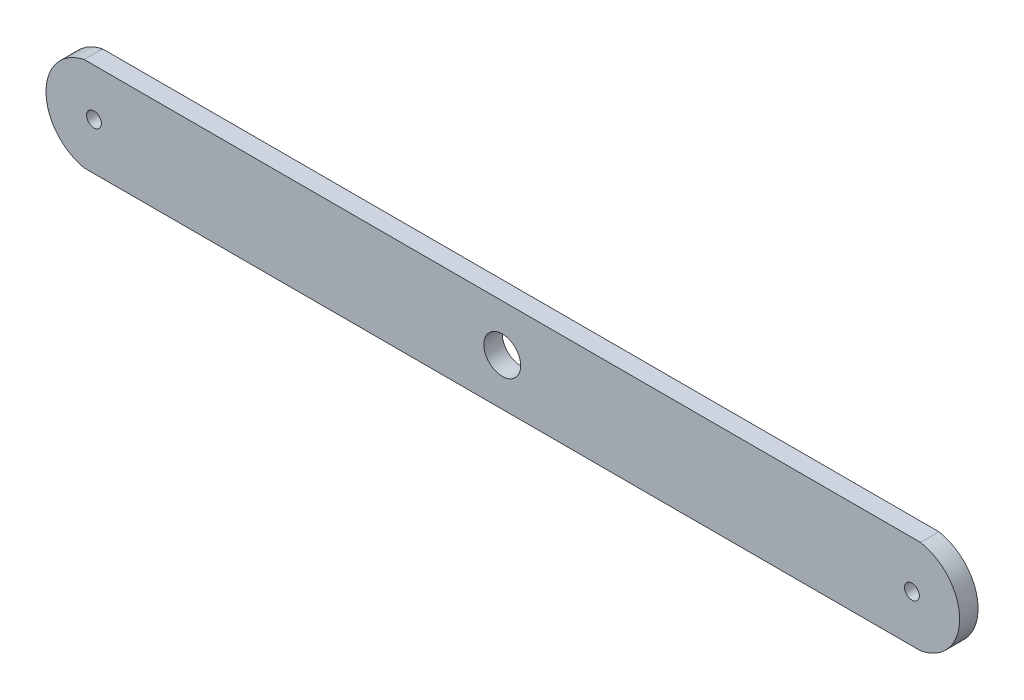
ISO-10303-21;
HEADER;
FILE_DESCRIPTION(('STEP AP214'),'2;1');
FILE_NAME('part.step','',(''),(''),'','','');
FILE_SCHEMA(('AUTOMOTIVE_DESIGN { 1 0 10303 214 1 1 1 1 }'));
ENDSEC;
DATA;
#1=APPLICATION_CONTEXT('core data for automotive mechanical design processes');
#2=APPLICATION_PROTOCOL_DEFINITION('international standard','automotive_design',2000,#1);
#3=PRODUCT_CONTEXT('',#1,'mechanical');
#4=PRODUCT('Part','Part','',(#3));
#5=PRODUCT_RELATED_PRODUCT_CATEGORY('part','',(#4));
#6=PRODUCT_DEFINITION_FORMATION('','',#4);
#7=PRODUCT_DEFINITION_CONTEXT('part definition',#1,'design');
#8=PRODUCT_DEFINITION('design','',#6,#7);
#9=PRODUCT_DEFINITION_SHAPE('','',#8);
#10=(LENGTH_UNIT() NAMED_UNIT(*) SI_UNIT(.MILLI.,.METRE.));
#11=(NAMED_UNIT(*) PLANE_ANGLE_UNIT() SI_UNIT($,.RADIAN.));
#12=(NAMED_UNIT(*) SI_UNIT($,.STERADIAN.) SOLID_ANGLE_UNIT());
#13=UNCERTAINTY_MEASURE_WITH_UNIT(LENGTH_MEASURE(1.E-05),#10,'distance_accuracy_value','');
#14=(GEOMETRIC_REPRESENTATION_CONTEXT(3) GLOBAL_UNCERTAINTY_ASSIGNED_CONTEXT((#13)) GLOBAL_UNIT_ASSIGNED_CONTEXT((#10,
#11,#12)) REPRESENTATION_CONTEXT('',''));
#15=CARTESIAN_POINT('',(0.,0.,0.));
#16=DIRECTION('',(0.,0.,1.));
#17=DIRECTION('',(1.,0.,0.));
#18=AXIS2_PLACEMENT_3D('',#15,#16,#17);
#19=CARTESIAN_POINT('',(-228.502311114203,0.523539483722092,10.));
#20=DIRECTION('',(0.,0.,1.));
#21=DIRECTION('',(1.,0.,0.));
#22=AXIS2_PLACEMENT_3D('',#19,#20,#21);
#23=PLANE('',#22);
#24=CARTESIAN_POINT('',(-6.88731111420254,0.523539483722092,10.));
#25=DIRECTION('',(0.,0.,1.));
#26=DIRECTION('',(1.,0.,0.));
#27=AXIS2_PLACEMENT_3D('',#24,#25,#26);
#28=CIRCLE('',#27,10.);
#29=CARTESIAN_POINT('',(3.11268888579746,0.523539483722092,10.));
#30=VERTEX_POINT('',#29);
#31=EDGE_CURVE('E136',#30,#30,#28,.T.);
#32=ORIENTED_EDGE('',*,*,#31,.F.);
#33=EDGE_LOOP('',(#32));
#34=FACE_BOUND('',#33,.T.);
#35=CARTESIAN_POINT('',(-228.502311114203,0.523539483722092,10.));
#36=DIRECTION('',(0.,0.,1.));
#37=DIRECTION('',(1.,0.,0.));
#38=AXIS2_PLACEMENT_3D('',#35,#36,#37);
#39=CIRCLE('',#38,26.048873997566);
#40=CARTESIAN_POINT('',(-233.912946186712,26.0042942734295,10.));
#41=VERTEX_POINT('',#40);
#42=CARTESIAN_POINT('',(-233.912946186712,-24.9572153059853,10.));
#43=VERTEX_POINT('',#42);
#44=EDGE_CURVE('E94',#41,#43,#39,.T.);
#45=ORIENTED_EDGE('',*,*,#44,.T.);
#46=DIRECTION('',(1.,0.,0.));
#47=VECTOR('',#46,1.);
#48=CARTESIAN_POINT('',(-233.912946186712,-24.9572153059853,10.));
#49=LINE('',#48,#47);
#50=CARTESIAN_POINT('',(220.138323958307,-24.9572153059853,10.));
#51=VERTEX_POINT('',#50);
#52=EDGE_CURVE('E89',#43,#51,#49,.T.);
#53=ORIENTED_EDGE('',*,*,#52,.T.);
#54=CARTESIAN_POINT('',(215.497688885797,0.523539483722092,10.));
#55=DIRECTION('',(0.,0.,1.));
#56=DIRECTION('',(1.,0.,0.));
#57=AXIS2_PLACEMENT_3D('',#54,#55,#56);
#58=CIRCLE('',#57,25.8998910910723);
#59=CARTESIAN_POINT('',(220.138323958307,26.0042942734295,10.));
#60=VERTEX_POINT('',#59);
#61=EDGE_CURVE('E92',#51,#60,#58,.T.);
#62=ORIENTED_EDGE('',*,*,#61,.T.);
#63=DIRECTION('',(-1.,0.,0.));
#64=VECTOR('',#63,1.);
#65=CARTESIAN_POINT('',(-233.912946186712,26.0042942734295,10.));
#66=LINE('',#65,#64);
#67=EDGE_CURVE('E59',#60,#41,#66,.T.);
#68=ORIENTED_EDGE('',*,*,#67,.T.);
#69=EDGE_LOOP('',(#45,#53,#62,#68));
#70=FACE_BOUND('',#69,.T.);
#71=CARTESIAN_POINT('',(-228.502311114203,0.523539483722092,10.));
#72=DIRECTION('',(0.,0.,1.));
#73=DIRECTION('',(1.,0.,0.));
#74=AXIS2_PLACEMENT_3D('',#71,#72,#73);
#75=CIRCLE('',#74,3.99999999999999);
#76=CARTESIAN_POINT('',(-224.502311114203,0.523539483722092,10.));
#77=VERTEX_POINT('',#76);
#78=EDGE_CURVE('E114',#77,#77,#75,.T.);
#79=ORIENTED_EDGE('',*,*,#78,.F.);
#80=EDGE_LOOP('',(#79));
#81=FACE_BOUND('',#80,.T.);
#82=CARTESIAN_POINT('',(215.497688885797,0.523539483722092,10.));
#83=DIRECTION('',(0.,0.,1.));
#84=DIRECTION('',(1.,0.,0.));
#85=AXIS2_PLACEMENT_3D('',#82,#83,#84);
#86=CIRCLE('',#85,3.99999999999999);
#87=CARTESIAN_POINT('',(219.497688885797,0.523539483722092,10.));
#88=VERTEX_POINT('',#87);
#89=EDGE_CURVE('E144',#88,#88,#86,.T.);
#90=ORIENTED_EDGE('',*,*,#89,.F.);
#91=EDGE_LOOP('',(#90));
#92=FACE_BOUND('',#91,.T.);
#93=ADVANCED_FACE('F41',(#34,#70,#81,#92),#23,.T.);
#94=CARTESIAN_POINT('',(-228.502311114203,0.523539483722092,0.));
#95=DIRECTION('',(0.,0.,1.));
#96=DIRECTION('',(1.,0.,0.));
#97=AXIS2_PLACEMENT_3D('',#94,#95,#96);
#98=PLANE('',#97);
#99=CARTESIAN_POINT('',(-228.502311114203,0.523539483722092,0.));
#100=DIRECTION('',(0.,0.,1.));
#101=DIRECTION('',(1.,0.,0.));
#102=AXIS2_PLACEMENT_3D('',#99,#100,#101);
#103=CIRCLE('',#102,26.048873997566);
#104=CARTESIAN_POINT('',(-233.912946186712,26.0042942734295,0.));
#105=VERTEX_POINT('',#104);
#106=CARTESIAN_POINT('',(-233.912946186712,-24.9572153059853,0.));
#107=VERTEX_POINT('',#106);
#108=EDGE_CURVE('E110',#105,#107,#103,.T.);
#109=ORIENTED_EDGE('',*,*,#108,.F.);
#110=DIRECTION('',(-1.,0.,0.));
#111=VECTOR('',#110,1.);
#112=CARTESIAN_POINT('',(-233.912946186712,26.0042942734295,0.));
#113=LINE('',#112,#111);
#114=CARTESIAN_POINT('',(220.138323958307,26.0042942734295,0.));
#115=VERTEX_POINT('',#114);
#116=EDGE_CURVE('E82',#115,#105,#113,.T.);
#117=ORIENTED_EDGE('',*,*,#116,.F.);
#118=CARTESIAN_POINT('',(215.497688885797,0.523539483722092,0.));
#119=DIRECTION('',(0.,0.,1.));
#120=DIRECTION('',(1.,0.,0.));
#121=AXIS2_PLACEMENT_3D('',#118,#119,#120);
#122=CIRCLE('',#121,25.8998910910723);
#123=CARTESIAN_POINT('',(220.138323958307,-24.9572153059853,0.));
#124=VERTEX_POINT('',#123);
#125=EDGE_CURVE('E76',#124,#115,#122,.T.);
#126=ORIENTED_EDGE('',*,*,#125,.F.);
#127=DIRECTION('',(1.,0.,0.));
#128=VECTOR('',#127,1.);
#129=CARTESIAN_POINT('',(-233.912946186712,-24.9572153059853,0.));
#130=LINE('',#129,#128);
#131=EDGE_CURVE('E99',#107,#124,#130,.T.);
#132=ORIENTED_EDGE('',*,*,#131,.F.);
#133=EDGE_LOOP('',(#109,#117,#126,#132));
#134=FACE_BOUND('',#133,.T.);
#135=CARTESIAN_POINT('',(-228.502311114203,0.523539483722092,0.));
#136=DIRECTION('',(0.,0.,1.));
#137=DIRECTION('',(1.,0.,0.));
#138=AXIS2_PLACEMENT_3D('',#135,#136,#137);
#139=CIRCLE('',#138,3.99999999999999);
#140=CARTESIAN_POINT('',(-224.502311114203,0.523539483722092,0.));
#141=VERTEX_POINT('',#140);
#142=EDGE_CURVE('E132',#141,#141,#139,.T.);
#143=ORIENTED_EDGE('',*,*,#142,.T.);
#144=EDGE_LOOP('',(#143));
#145=FACE_BOUND('',#144,.T.);
#146=CARTESIAN_POINT('',(-6.88731111420254,0.523539483722092,0.));
#147=DIRECTION('',(0.,0.,1.));
#148=DIRECTION('',(1.,0.,0.));
#149=AXIS2_PLACEMENT_3D('',#146,#147,#148);
#150=CIRCLE('',#149,10.);
#151=CARTESIAN_POINT('',(3.11268888579746,0.523539483722092,0.));
#152=VERTEX_POINT('',#151);
#153=EDGE_CURVE('E140',#152,#152,#150,.T.);
#154=ORIENTED_EDGE('',*,*,#153,.T.);
#155=EDGE_LOOP('',(#154));
#156=FACE_BOUND('',#155,.T.);
#157=CARTESIAN_POINT('',(215.497688885797,0.523539483722092,0.));
#158=DIRECTION('',(0.,0.,1.));
#159=DIRECTION('',(1.,0.,0.));
#160=AXIS2_PLACEMENT_3D('',#157,#158,#159);
#161=CIRCLE('',#160,3.99999999999999);
#162=CARTESIAN_POINT('',(219.497688885797,0.523539483722092,0.));
#163=VERTEX_POINT('',#162);
#164=EDGE_CURVE('E148',#163,#163,#161,.T.);
#165=ORIENTED_EDGE('',*,*,#164,.T.);
#166=EDGE_LOOP('',(#165));
#167=FACE_BOUND('',#166,.T.);
#168=ADVANCED_FACE('F127',(#134,#145,#156,#167),#98,.F.);
#169=CARTESIAN_POINT('',(-228.502311114203,0.523539483722092,10.));
#170=DIRECTION('',(0.,0.,-1.));
#171=DIRECTION('',(-1.,0.,0.));
#172=AXIS2_PLACEMENT_3D('',#169,#170,#171);
#173=CYLINDRICAL_SURFACE('',#172,26.048873997566);
#174=ORIENTED_EDGE('',*,*,#108,.T.);
#175=DIRECTION('',(0.,0.,-1.));
#176=VECTOR('',#175,1.);
#177=CARTESIAN_POINT('',(-233.912946186712,-24.9572153059853,10.));
#178=LINE('',#177,#176);
#179=EDGE_CURVE('E11',#43,#107,#178,.T.);
#180=ORIENTED_EDGE('',*,*,#179,.F.);
#181=ORIENTED_EDGE('',*,*,#44,.F.);
#182=DIRECTION('',(0.,0.,-1.));
#183=VECTOR('',#182,1.);
#184=CARTESIAN_POINT('',(-233.912946186712,26.0042942734295,10.));
#185=LINE('',#184,#183);
#186=EDGE_CURVE('E106',#41,#105,#185,.T.);
#187=ORIENTED_EDGE('',*,*,#186,.T.);
#188=EDGE_LOOP('',(#174,#180,#181,#187));
#189=FACE_BOUND('',#188,.T.);
#190=ADVANCED_FACE('F43',(#189),#173,.T.);
#191=CARTESIAN_POINT('',(-233.912946186712,-24.9572153059853,10.));
#192=DIRECTION('',(0.,1.,0.));
#193=DIRECTION('',(-1.,0.,0.));
#194=AXIS2_PLACEMENT_3D('',#191,#192,#193);
#195=PLANE('',#194);
#196=ORIENTED_EDGE('',*,*,#131,.T.);
#197=DIRECTION('',(0.,0.,-1.));
#198=VECTOR('',#197,1.);
#199=CARTESIAN_POINT('',(220.138323958307,-24.9572153059853,10.));
#200=LINE('',#199,#198);
#201=EDGE_CURVE('E51',#51,#124,#200,.T.);
#202=ORIENTED_EDGE('',*,*,#201,.F.);
#203=ORIENTED_EDGE('',*,*,#52,.F.);
#204=ORIENTED_EDGE('',*,*,#179,.T.);
#205=EDGE_LOOP('',(#196,#202,#203,#204));
#206=FACE_BOUND('',#205,.T.);
#207=ADVANCED_FACE('F98',(#206),#195,.F.);
#208=CARTESIAN_POINT('',(215.497688885797,0.523539483722092,10.));
#209=DIRECTION('',(0.,0.,-1.));
#210=DIRECTION('',(-1.,0.,0.));
#211=AXIS2_PLACEMENT_3D('',#208,#209,#210);
#212=CYLINDRICAL_SURFACE('',#211,25.8998910910723);
#213=ORIENTED_EDGE('',*,*,#125,.T.);
#214=DIRECTION('',(0.,0.,-1.));
#215=VECTOR('',#214,1.);
#216=CARTESIAN_POINT('',(220.138323958307,26.0042942734295,10.));
#217=LINE('',#216,#215);
#218=EDGE_CURVE('E101',#60,#115,#217,.T.);
#219=ORIENTED_EDGE('',*,*,#218,.F.);
#220=ORIENTED_EDGE('',*,*,#61,.F.);
#221=ORIENTED_EDGE('',*,*,#201,.T.);
#222=EDGE_LOOP('',(#213,#219,#220,#221));
#223=FACE_BOUND('',#222,.T.);
#224=ADVANCED_FACE('F102',(#223),#212,.T.);
#225=CARTESIAN_POINT('',(-233.912946186712,26.0042942734295,10.));
#226=DIRECTION('',(0.,-1.,0.));
#227=DIRECTION('',(1.,0.,0.));
#228=AXIS2_PLACEMENT_3D('',#225,#226,#227);
#229=PLANE('',#228);
#230=ORIENTED_EDGE('',*,*,#116,.T.);
#231=ORIENTED_EDGE('',*,*,#186,.F.);
#232=ORIENTED_EDGE('',*,*,#67,.F.);
#233=ORIENTED_EDGE('',*,*,#218,.T.);
#234=EDGE_LOOP('',(#230,#231,#232,#233));
#235=FACE_BOUND('',#234,.T.);
#236=ADVANCED_FACE('F124',(#235),#229,.F.);
#237=CARTESIAN_POINT('',(-228.502311114203,0.523539483722092,10.));
#238=DIRECTION('',(0.,0.,-1.));
#239=DIRECTION('',(-1.,0.,0.));
#240=AXIS2_PLACEMENT_3D('',#237,#238,#239);
#241=CYLINDRICAL_SURFACE('',#240,3.99999999999999);
#242=ORIENTED_EDGE('',*,*,#78,.T.);
#243=EDGE_LOOP('',(#242));
#244=FACE_BOUND('',#243,.T.);
#245=ORIENTED_EDGE('',*,*,#142,.F.);
#246=EDGE_LOOP('',(#245));
#247=FACE_BOUND('',#246,.T.);
#248=ADVANCED_FACE('F168',(#244,#247),#241,.F.);
#249=CARTESIAN_POINT('',(-6.88731111420254,0.523539483722092,10.));
#250=DIRECTION('',(0.,0.,-1.));
#251=DIRECTION('',(-1.,0.,0.));
#252=AXIS2_PLACEMENT_3D('',#249,#250,#251);
#253=CYLINDRICAL_SURFACE('',#252,10.);
#254=ORIENTED_EDGE('',*,*,#31,.T.);
#255=EDGE_LOOP('',(#254));
#256=FACE_BOUND('',#255,.T.);
#257=ORIENTED_EDGE('',*,*,#153,.F.);
#258=EDGE_LOOP('',(#257));
#259=FACE_BOUND('',#258,.T.);
#260=ADVANCED_FACE('F236',(#256,#259),#253,.F.);
#261=CARTESIAN_POINT('',(215.497688885797,0.523539483722092,10.));
#262=DIRECTION('',(0.,0.,-1.));
#263=DIRECTION('',(-1.,0.,0.));
#264=AXIS2_PLACEMENT_3D('',#261,#262,#263);
#265=CYLINDRICAL_SURFACE('',#264,3.99999999999999);
#266=ORIENTED_EDGE('',*,*,#89,.T.);
#267=EDGE_LOOP('',(#266));
#268=FACE_BOUND('',#267,.T.);
#269=ORIENTED_EDGE('',*,*,#164,.F.);
#270=EDGE_LOOP('',(#269));
#271=FACE_BOUND('',#270,.T.);
#272=ADVANCED_FACE('F156',(#268,#271),#265,.F.);
#273=CLOSED_SHELL('',(#93,#168,#190,#207,#224,#236,#248,#260,#272));
#274=MANIFOLD_SOLID_BREP('B2',#273);
#275=ADVANCED_BREP_SHAPE_REPRESENTATION('',(#18,#274),#14);
#276=SHAPE_DEFINITION_REPRESENTATION(#9,#275);
ENDSEC;
END-ISO-10303-21;
